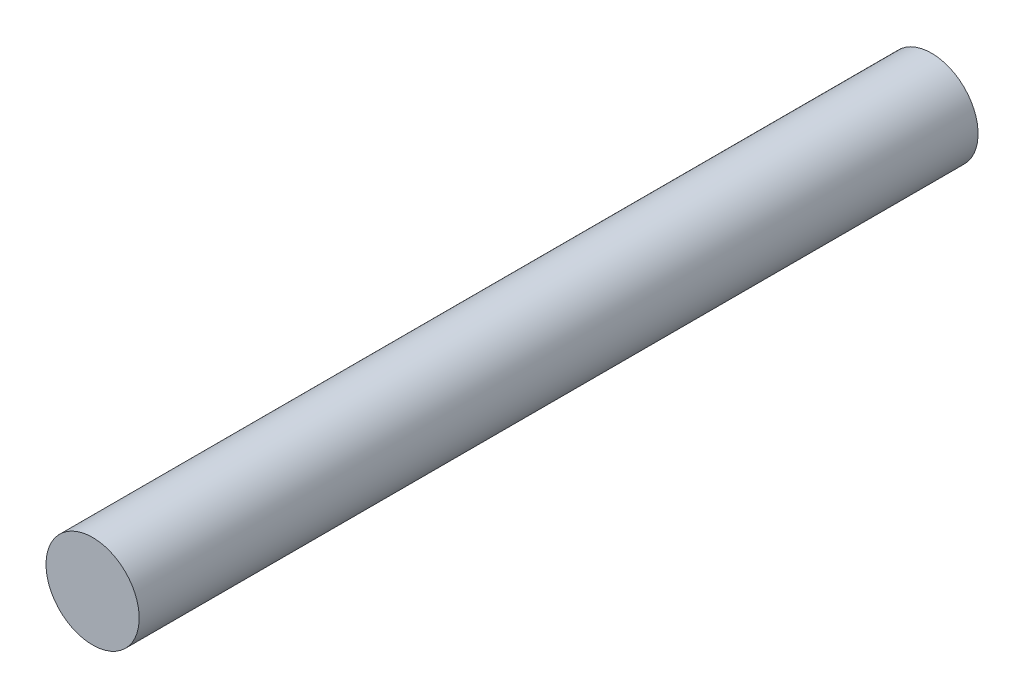
ISO-10303-21;
HEADER;
FILE_DESCRIPTION(('STEP AP214'),'2;1');
FILE_NAME('part.step','',(''),(''),'','','');
FILE_SCHEMA(('AUTOMOTIVE_DESIGN { 1 0 10303 214 1 1 1 1 }'));
ENDSEC;
DATA;
#1=APPLICATION_CONTEXT('core data for automotive mechanical design processes');
#2=APPLICATION_PROTOCOL_DEFINITION('international standard','automotive_design',2000,#1);
#3=PRODUCT_CONTEXT('',#1,'mechanical');
#4=PRODUCT('Part','Part','',(#3));
#5=PRODUCT_RELATED_PRODUCT_CATEGORY('part','',(#4));
#6=PRODUCT_DEFINITION_FORMATION('','',#4);
#7=PRODUCT_DEFINITION_CONTEXT('part definition',#1,'design');
#8=PRODUCT_DEFINITION('design','',#6,#7);
#9=PRODUCT_DEFINITION_SHAPE('','',#8);
#10=(LENGTH_UNIT() NAMED_UNIT(*) SI_UNIT(.MILLI.,.METRE.));
#11=(NAMED_UNIT(*) PLANE_ANGLE_UNIT() SI_UNIT($,.RADIAN.));
#12=(NAMED_UNIT(*) SI_UNIT($,.STERADIAN.) SOLID_ANGLE_UNIT());
#13=UNCERTAINTY_MEASURE_WITH_UNIT(LENGTH_MEASURE(1.E-05),#10,'distance_accuracy_value','');
#14=(GEOMETRIC_REPRESENTATION_CONTEXT(3) GLOBAL_UNCERTAINTY_ASSIGNED_CONTEXT((#13)) GLOBAL_UNIT_ASSIGNED_CONTEXT((#10,
#11,#12)) REPRESENTATION_CONTEXT('',''));
#15=CARTESIAN_POINT('',(0.,0.,0.));
#16=DIRECTION('',(0.,0.,1.));
#17=DIRECTION('',(1.,0.,0.));
#18=AXIS2_PLACEMENT_3D('',#15,#16,#17);
#19=CARTESIAN_POINT('',(0.,0.,228.6));
#20=DIRECTION('',(0.,0.,-1.));
#21=DIRECTION('',(-1.,0.,0.));
#22=AXIS2_PLACEMENT_3D('',#19,#20,#21);
#23=CYLINDRICAL_SURFACE('',#22,12.7);
#24=CARTESIAN_POINT('',(0.,0.,228.6));
#25=DIRECTION('',(0.,0.,1.));
#26=DIRECTION('',(1.,0.,0.));
#27=AXIS2_PLACEMENT_3D('',#24,#25,#26);
#28=CIRCLE('',#27,12.7);
#29=CARTESIAN_POINT('',(-12.7,0.,228.6));
#30=VERTEX_POINT('',#29);
#31=EDGE_CURVE('E10',#30,#30,#28,.T.);
#32=CARTESIAN_POINT('',(0.,0.,0.));
#33=DIRECTION('',(0.,0.,1.));
#34=DIRECTION('',(1.,0.,0.));
#35=AXIS2_PLACEMENT_3D('',#32,#33,#34);
#36=CIRCLE('',#35,12.7);
#37=CARTESIAN_POINT('',(-12.7,0.,0.));
#38=VERTEX_POINT('',#37);
#39=EDGE_CURVE('E40',#38,#38,#36,.T.);
#40=CARTESIAN_POINT('',(-12.7,0.,228.6));
#41=CARTESIAN_POINT('',(-12.7,0.,226.21875));
#42=CARTESIAN_POINT('',(-12.7,0.,223.8375));
#43=CARTESIAN_POINT('',(-12.7,0.,219.075));
#44=CARTESIAN_POINT('',(-12.7,0.,216.69375));
#45=CARTESIAN_POINT('',(-12.7,0.,211.93125));
#46=CARTESIAN_POINT('',(-12.7,0.,209.55));
#47=CARTESIAN_POINT('',(-12.7,0.,204.7875));
#48=CARTESIAN_POINT('',(-12.7,0.,202.40625));
#49=CARTESIAN_POINT('',(-12.7,0.,197.64375));
#50=CARTESIAN_POINT('',(-12.7,0.,195.2625));
#51=CARTESIAN_POINT('',(-12.7,0.,190.5));
#52=CARTESIAN_POINT('',(-12.7,0.,188.11875));
#53=CARTESIAN_POINT('',(-12.7,0.,183.35625));
#54=CARTESIAN_POINT('',(-12.7,0.,180.975));
#55=CARTESIAN_POINT('',(-12.7,0.,176.2125));
#56=CARTESIAN_POINT('',(-12.7,0.,173.83125));
#57=CARTESIAN_POINT('',(-12.7,0.,169.06875));
#58=CARTESIAN_POINT('',(-12.7,0.,166.6875));
#59=CARTESIAN_POINT('',(-12.7,0.,161.925));
#60=CARTESIAN_POINT('',(-12.7,0.,159.54375));
#61=CARTESIAN_POINT('',(-12.7,0.,154.78125));
#62=CARTESIAN_POINT('',(-12.7,0.,152.4));
#63=CARTESIAN_POINT('',(-12.7,0.,147.6375));
#64=CARTESIAN_POINT('',(-12.7,0.,145.25625));
#65=CARTESIAN_POINT('',(-12.7,0.,140.49375));
#66=CARTESIAN_POINT('',(-12.7,0.,138.1125));
#67=CARTESIAN_POINT('',(-12.7,0.,133.35));
#68=CARTESIAN_POINT('',(-12.7,0.,130.96875));
#69=CARTESIAN_POINT('',(-12.7,0.,126.20625));
#70=CARTESIAN_POINT('',(-12.7,0.,123.825));
#71=CARTESIAN_POINT('',(-12.7,0.,119.0625));
#72=CARTESIAN_POINT('',(-12.7,0.,116.68125));
#73=CARTESIAN_POINT('',(-12.7,0.,111.91875));
#74=CARTESIAN_POINT('',(-12.7,0.,109.5375));
#75=CARTESIAN_POINT('',(-12.7,0.,104.775));
#76=CARTESIAN_POINT('',(-12.7,0.,102.39375));
#77=CARTESIAN_POINT('',(-12.7,0.,97.63125));
#78=CARTESIAN_POINT('',(-12.7,0.,95.25));
#79=CARTESIAN_POINT('',(-12.7,0.,90.4875));
#80=CARTESIAN_POINT('',(-12.7,0.,88.10625));
#81=CARTESIAN_POINT('',(-12.7,0.,83.34375));
#82=CARTESIAN_POINT('',(-12.7,0.,80.9625));
#83=CARTESIAN_POINT('',(-12.7,0.,76.2));
#84=CARTESIAN_POINT('',(-12.7,0.,73.81875));
#85=CARTESIAN_POINT('',(-12.7,0.,69.05625));
#86=CARTESIAN_POINT('',(-12.7,0.,66.675));
#87=CARTESIAN_POINT('',(-12.7,0.,61.9125));
#88=CARTESIAN_POINT('',(-12.7,0.,59.53125));
#89=CARTESIAN_POINT('',(-12.7,0.,54.76875));
#90=CARTESIAN_POINT('',(-12.7,0.,52.3875));
#91=CARTESIAN_POINT('',(-12.7,0.,47.625));
#92=CARTESIAN_POINT('',(-12.7,0.,45.24375));
#93=CARTESIAN_POINT('',(-12.7,0.,40.48125));
#94=CARTESIAN_POINT('',(-12.7,0.,38.1));
#95=CARTESIAN_POINT('',(-12.7,0.,33.3375));
#96=CARTESIAN_POINT('',(-12.7,0.,30.95625));
#97=CARTESIAN_POINT('',(-12.7,0.,26.19375));
#98=CARTESIAN_POINT('',(-12.7,0.,23.8125));
#99=CARTESIAN_POINT('',(-12.7,0.,19.05));
#100=CARTESIAN_POINT('',(-12.7,0.,16.66875));
#101=CARTESIAN_POINT('',(-12.7,0.,11.90625));
#102=CARTESIAN_POINT('',(-12.7,0.,9.52499999999998));
#103=CARTESIAN_POINT('',(-12.7,0.,4.76249999999997));
#104=CARTESIAN_POINT('',(-12.7,0.,2.38124999999997));
#105=CARTESIAN_POINT('',(-12.7,0.,0.));
#106=B_SPLINE_CURVE_WITH_KNOTS('',3,(#40,#41,#42,#43,#44,#45,#46,#47,#48,#49,#50,#51,#52,#53,
#54,#55,#56,#57,#58,#59,#60,#61,#62,#63,#64,#65,#66,#67,#68,#69,#70,#71,#72,#73,#74,#75,#76,#77,
#78,#79,#80,#81,#82,#83,#84,#85,#86,#87,#88,#89,#90,#91,#92,#93,#94,#95,#96,#97,#98,#99,#100,
#101,#102,#103,#104,#105),.UNSPECIFIED.,.F.,.F.,(4,2,2,2,2,2,2,2,2,2,2,2,2,2,2,2,2,2,2,2,2,2,2,
2,2,2,2,2,2,2,2,2,4),(0.,7.14375,14.2875,21.43125,28.575,35.71875,42.8625,50.00625,57.15,
64.29375,71.4375,78.58125,85.725,92.86875,100.0125,107.15625,114.3,121.44375,128.5875,135.73125,
142.875,150.01875,157.1625,164.30625,171.45,178.59375,185.7375,192.88125,200.025,207.16875,
214.3125,221.45625,228.6),.UNSPECIFIED.);
#107=EDGE_CURVE('BSEAM37',#30,#38,#106,.T.);
#108=ORIENTED_EDGE('',*,*,#31,.F.);
#109=ORIENTED_EDGE('',*,*,#39,.T.);
#110=ORIENTED_EDGE('',*,*,#107,.T.);
#111=ORIENTED_EDGE('',*,*,#107,.F.);
#112=EDGE_LOOP('',(#108,#110,#109,#111));
#113=FACE_BOUND('',#112,.T.);
#114=ADVANCED_FACE('F37',(#113),#23,.T.);
#115=CARTESIAN_POINT('',(0.,0.,228.6));
#116=DIRECTION('',(0.,0.,1.));
#117=DIRECTION('',(1.,0.,0.));
#118=AXIS2_PLACEMENT_3D('',#115,#116,#117);
#119=PLANE('',#118);
#120=ORIENTED_EDGE('',*,*,#31,.T.);
#121=EDGE_LOOP('',(#120));
#122=FACE_BOUND('',#121,.T.);
#123=ADVANCED_FACE('F54',(#122),#119,.T.);
#124=CARTESIAN_POINT('',(0.,0.,0.));
#125=DIRECTION('',(0.,0.,1.));
#126=DIRECTION('',(1.,0.,0.));
#127=AXIS2_PLACEMENT_3D('',#124,#125,#126);
#128=PLANE('',#127);
#129=ORIENTED_EDGE('',*,*,#39,.F.);
#130=EDGE_LOOP('',(#129));
#131=FACE_BOUND('',#130,.T.);
#132=ADVANCED_FACE('F52',(#131),#128,.F.);
#133=CLOSED_SHELL('',(#114,#123,#132));
#134=MANIFOLD_SOLID_BREP('B2',#133);
#135=ADVANCED_BREP_SHAPE_REPRESENTATION('',(#18,#134),#14);
#136=SHAPE_DEFINITION_REPRESENTATION(#9,#135);
ENDSEC;
END-ISO-10303-21;
